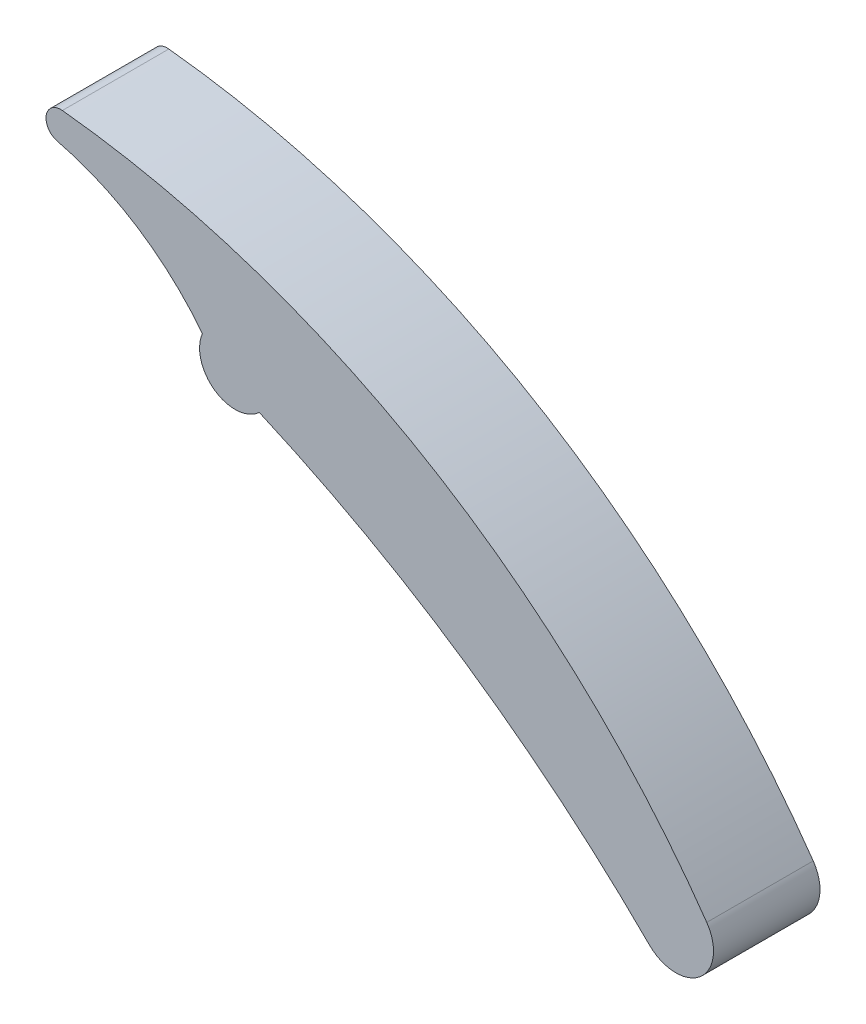
ISO-10303-21;
HEADER;
FILE_DESCRIPTION(('STEP AP214'),'2;1');
FILE_NAME('part.step','',(''),(''),'','','');
FILE_SCHEMA(('AUTOMOTIVE_DESIGN { 1 0 10303 214 1 1 1 1 }'));
ENDSEC;
DATA;
#1=APPLICATION_CONTEXT('core data for automotive mechanical design processes');
#2=APPLICATION_PROTOCOL_DEFINITION('international standard','automotive_design',2000,#1);
#3=PRODUCT_CONTEXT('',#1,'mechanical');
#4=PRODUCT('Part','Part','',(#3));
#5=PRODUCT_RELATED_PRODUCT_CATEGORY('part','',(#4));
#6=PRODUCT_DEFINITION_FORMATION('','',#4);
#7=PRODUCT_DEFINITION_CONTEXT('part definition',#1,'design');
#8=PRODUCT_DEFINITION('design','',#6,#7);
#9=PRODUCT_DEFINITION_SHAPE('','',#8);
#10=(LENGTH_UNIT() NAMED_UNIT(*) SI_UNIT(.MILLI.,.METRE.));
#11=(NAMED_UNIT(*) PLANE_ANGLE_UNIT() SI_UNIT($,.RADIAN.));
#12=(NAMED_UNIT(*) SI_UNIT($,.STERADIAN.) SOLID_ANGLE_UNIT());
#13=UNCERTAINTY_MEASURE_WITH_UNIT(LENGTH_MEASURE(1.E-05),#10,'distance_accuracy_value','');
#14=(GEOMETRIC_REPRESENTATION_CONTEXT(3) GLOBAL_UNCERTAINTY_ASSIGNED_CONTEXT((#13)) GLOBAL_UNIT_ASSIGNED_CONTEXT((#10,
#11,#12)) REPRESENTATION_CONTEXT('',''));
#15=CARTESIAN_POINT('',(0.,0.,0.));
#16=DIRECTION('',(0.,0.,1.));
#17=DIRECTION('',(1.,0.,0.));
#18=AXIS2_PLACEMENT_3D('',#15,#16,#17);
#19=CARTESIAN_POINT('',(-49.1044540456095,34.4782916178082,15.));
#20=DIRECTION('',(0.,0.,-1.));
#21=DIRECTION('',(-1.,0.,0.));
#22=AXIS2_PLACEMENT_3D('',#19,#20,#21);
#23=CYLINDRICAL_SURFACE('',#22,4.17090482656178);
#24=CARTESIAN_POINT('',(-49.1044540456095,34.4782916178082,-15.));
#25=DIRECTION('',(0.,0.,-1.));
#26=DIRECTION('',(-1.,0.,0.));
#27=AXIS2_PLACEMENT_3D('',#24,#25,#26);
#28=CIRCLE('',#27,4.17090482656178);
#29=CARTESIAN_POINT('',(-50.1017609381639,30.428374824305,-15.));
#30=VERTEX_POINT('',#29);
#31=CARTESIAN_POINT('',(-48.6620533884795,38.6256677438435,-15.));
#32=VERTEX_POINT('',#31);
#33=EDGE_CURVE('E119',#30,#32,#28,.T.);
#34=ORIENTED_EDGE('',*,*,#33,.F.);
#35=DIRECTION('',(0.,0.,-1.));
#36=VECTOR('',#35,1.);
#37=CARTESIAN_POINT('',(-50.1017609381639,30.428374824305,15.));
#38=LINE('',#37,#36);
#39=CARTESIAN_POINT('',(-50.1017609381639,30.428374824305,15.));
#40=VERTEX_POINT('',#39);
#41=EDGE_CURVE('E11',#40,#30,#38,.T.);
#42=ORIENTED_EDGE('',*,*,#41,.F.);
#43=CARTESIAN_POINT('',(-49.1044540456095,34.4782916178082,15.));
#44=DIRECTION('',(0.,0.,-1.));
#45=DIRECTION('',(-1.,0.,0.));
#46=AXIS2_PLACEMENT_3D('',#43,#44,#45);
#47=CIRCLE('',#46,4.17090482656178);
#48=CARTESIAN_POINT('',(-48.6620533884795,38.6256677438435,15.));
#49=VERTEX_POINT('',#48);
#50=EDGE_CURVE('E132',#40,#49,#47,.T.);
#51=ORIENTED_EDGE('',*,*,#50,.T.);
#52=DIRECTION('',(0.,0.,-1.));
#53=VECTOR('',#52,1.);
#54=CARTESIAN_POINT('',(-48.6620533884795,38.6256677438435,15.));
#55=LINE('',#54,#53);
#56=EDGE_CURVE('E38',#49,#32,#55,.T.);
#57=ORIENTED_EDGE('',*,*,#56,.T.);
#58=EDGE_LOOP('',(#34,#42,#51,#57));
#59=FACE_BOUND('',#58,.T.);
#60=ADVANCED_FACE('F35',(#59),#23,.T.);
#61=CARTESIAN_POINT('',(-67.8912246654771,-41.8120242289201,15.));
#62=DIRECTION('',(0.,0.,-1.));
#63=DIRECTION('',(-1.,0.,0.));
#64=AXIS2_PLACEMENT_3D('',#61,#62,#63);
#65=CYLINDRICAL_SURFACE('',#64,74.3985233393418);
#66=CARTESIAN_POINT('',(-67.8912246654771,-41.8120242289201,-15.));
#67=DIRECTION('',(0.,0.,-1.));
#68=DIRECTION('',(-1.,0.,0.));
#69=AXIS2_PLACEMENT_3D('',#66,#67,#68);
#70=CIRCLE('',#69,74.3985233393418);
#71=CARTESIAN_POINT('',(-9.20259716589065,3.9130813181355,-15.));
#72=VERTEX_POINT('',#71);
#73=EDGE_CURVE('E131',#30,#72,#70,.T.);
#74=ORIENTED_EDGE('',*,*,#73,.T.);
#75=DIRECTION('',(0.,0.,-1.));
#76=VECTOR('',#75,1.);
#77=CARTESIAN_POINT('',(-9.20259716589065,3.9130813181355,15.));
#78=LINE('',#77,#76);
#79=CARTESIAN_POINT('',(-9.20259716589065,3.9130813181355,15.));
#80=VERTEX_POINT('',#79);
#81=EDGE_CURVE('E44',#80,#72,#78,.T.);
#82=ORIENTED_EDGE('',*,*,#81,.F.);
#83=CARTESIAN_POINT('',(-67.8912246654771,-41.8120242289201,15.));
#84=DIRECTION('',(0.,0.,-1.));
#85=DIRECTION('',(-1.,0.,0.));
#86=AXIS2_PLACEMENT_3D('',#83,#84,#85);
#87=CIRCLE('',#86,74.3985233393418);
#88=EDGE_CURVE('E114',#40,#80,#87,.T.);
#89=ORIENTED_EDGE('',*,*,#88,.F.);
#90=ORIENTED_EDGE('',*,*,#41,.T.);
#91=EDGE_LOOP('',(#74,#82,#89,#90));
#92=FACE_BOUND('',#91,.T.);
#93=ADVANCED_FACE('F140',(#92),#65,.F.);
#94=CARTESIAN_POINT('',(0.,0.,15.));
#95=DIRECTION('',(0.,0.,-1.));
#96=DIRECTION('',(-1.,0.,0.));
#97=AXIS2_PLACEMENT_3D('',#94,#95,#96);
#98=CYLINDRICAL_SURFACE('',#97,10.);
#99=CARTESIAN_POINT('',(0.,0.,-15.));
#100=DIRECTION('',(0.,0.,-1.));
#101=DIRECTION('',(-1.,0.,0.));
#102=AXIS2_PLACEMENT_3D('',#99,#100,#101);
#103=CIRCLE('',#102,10.);
#104=CARTESIAN_POINT('',(6.81477835298899,-7.31838752729265,-15.));
#105=VERTEX_POINT('',#104);
#106=EDGE_CURVE('E98',#105,#72,#103,.T.);
#107=ORIENTED_EDGE('',*,*,#106,.F.);
#108=DIRECTION('',(0.,0.,-1.));
#109=VECTOR('',#108,1.);
#110=CARTESIAN_POINT('',(6.81477835298899,-7.31838752729265,15.));
#111=LINE('',#110,#109);
#112=CARTESIAN_POINT('',(6.81477835298899,-7.31838752729265,15.));
#113=VERTEX_POINT('',#112);
#114=EDGE_CURVE('E92',#113,#105,#111,.T.);
#115=ORIENTED_EDGE('',*,*,#114,.F.);
#116=CARTESIAN_POINT('',(0.,0.,15.));
#117=DIRECTION('',(0.,0.,-1.));
#118=DIRECTION('',(-1.,0.,0.));
#119=AXIS2_PLACEMENT_3D('',#116,#117,#118);
#120=CIRCLE('',#119,10.);
#121=EDGE_CURVE('E96',#113,#80,#120,.T.);
#122=ORIENTED_EDGE('',*,*,#121,.T.);
#123=ORIENTED_EDGE('',*,*,#81,.T.);
#124=EDGE_LOOP('',(#107,#115,#122,#123));
#125=FACE_BOUND('',#124,.T.);
#126=ADVANCED_FACE('F94',(#125),#98,.T.);
#127=CARTESIAN_POINT('',(-136.612685388054,-335.664387312936,15.));
#128=DIRECTION('',(0.,0.,-1.));
#129=DIRECTION('',(-1.,0.,0.));
#130=AXIS2_PLACEMENT_3D('',#127,#128,#129);
#131=CYLINDRICAL_SURFACE('',#130,358.305083595561);
#132=CARTESIAN_POINT('',(-136.612685388054,-335.664387312936,-15.));
#133=DIRECTION('',(0.,0.,-1.));
#134=DIRECTION('',(-1.,0.,0.));
#135=AXIS2_PLACEMENT_3D('',#132,#133,#134);
#136=CIRCLE('',#135,358.305083595561);
#137=CARTESIAN_POINT('',(116.72801051163,-82.2851759883177,-15.));
#138=VERTEX_POINT('',#137);
#139=EDGE_CURVE('E128',#105,#138,#136,.T.);
#140=ORIENTED_EDGE('',*,*,#139,.T.);
#141=DIRECTION('',(0.,0.,-1.));
#142=VECTOR('',#141,1.);
#143=CARTESIAN_POINT('',(116.72801051163,-82.2851759883177,15.));
#144=LINE('',#143,#142);
#145=CARTESIAN_POINT('',(116.72801051163,-82.2851759883177,15.));
#146=VERTEX_POINT('',#145);
#147=EDGE_CURVE('E102',#146,#138,#144,.T.);
#148=ORIENTED_EDGE('',*,*,#147,.F.);
#149=CARTESIAN_POINT('',(-136.612685388054,-335.664387312936,15.));
#150=DIRECTION('',(0.,0.,-1.));
#151=DIRECTION('',(-1.,0.,0.));
#152=AXIS2_PLACEMENT_3D('',#149,#150,#151);
#153=CIRCLE('',#152,358.305083595561);
#154=EDGE_CURVE('E105',#113,#146,#153,.T.);
#155=ORIENTED_EDGE('',*,*,#154,.F.);
#156=ORIENTED_EDGE('',*,*,#114,.T.);
#157=EDGE_LOOP('',(#140,#148,#155,#156));
#158=FACE_BOUND('',#157,.T.);
#159=ADVANCED_FACE('F106',(#158),#131,.F.);
#160=CARTESIAN_POINT('',(124.225475611777,-74.7865710473995,15.));
#161=DIRECTION('',(0.,0.,-1.));
#162=DIRECTION('',(-1.,0.,0.));
#163=AXIS2_PLACEMENT_3D('',#160,#161,#162);
#164=CYLINDRICAL_SURFACE('',#163,10.6038228478168);
#165=CARTESIAN_POINT('',(124.225475611777,-74.7865710473995,-15.));
#166=DIRECTION('',(0.,0.,-1.));
#167=DIRECTION('',(-1.,0.,0.));
#168=AXIS2_PLACEMENT_3D('',#165,#166,#167);
#169=CIRCLE('',#168,10.6038228478168);
#170=CARTESIAN_POINT('',(132.921228365391,-68.7182151715548,-15.));
#171=VERTEX_POINT('',#170);
#172=EDGE_CURVE('E125',#171,#138,#169,.T.);
#173=ORIENTED_EDGE('',*,*,#172,.F.);
#174=DIRECTION('',(0.,0.,-1.));
#175=VECTOR('',#174,1.);
#176=CARTESIAN_POINT('',(132.921228365391,-68.7182151715548,15.));
#177=LINE('',#176,#175);
#178=CARTESIAN_POINT('',(132.921228365391,-68.7182151715548,15.));
#179=VERTEX_POINT('',#178);
#180=EDGE_CURVE('E135',#179,#171,#177,.T.);
#181=ORIENTED_EDGE('',*,*,#180,.F.);
#182=CARTESIAN_POINT('',(124.225475611777,-74.7865710473995,15.));
#183=DIRECTION('',(0.,0.,-1.));
#184=DIRECTION('',(-1.,0.,0.));
#185=AXIS2_PLACEMENT_3D('',#182,#183,#184);
#186=CIRCLE('',#185,10.6038228478168);
#187=EDGE_CURVE('E110',#179,#146,#186,.T.);
#188=ORIENTED_EDGE('',*,*,#187,.T.);
#189=ORIENTED_EDGE('',*,*,#147,.T.);
#190=EDGE_LOOP('',(#173,#181,#188,#189));
#191=FACE_BOUND('',#190,.T.);
#192=ADVANCED_FACE('F145',(#191),#164,.T.);
#193=CARTESIAN_POINT('',(-75.6375349899816,-214.261543383192,15.));
#194=DIRECTION('',(0.,0.,-1.));
#195=DIRECTION('',(-1.,0.,0.));
#196=AXIS2_PLACEMENT_3D('',#193,#194,#195);
#197=CYLINDRICAL_SURFACE('',#196,254.321879041585);
#198=CARTESIAN_POINT('',(-75.6375349899816,-214.261543383192,-15.));
#199=DIRECTION('',(0.,0.,-1.));
#200=DIRECTION('',(-1.,0.,0.));
#201=AXIS2_PLACEMENT_3D('',#198,#199,#200);
#202=CIRCLE('',#201,254.321879041585);
#203=EDGE_CURVE('E122',#32,#171,#202,.T.);
#204=ORIENTED_EDGE('',*,*,#203,.F.);
#205=ORIENTED_EDGE('',*,*,#56,.F.);
#206=CARTESIAN_POINT('',(-75.6375349899816,-214.261543383192,15.));
#207=DIRECTION('',(0.,0.,-1.));
#208=DIRECTION('',(-1.,0.,0.));
#209=AXIS2_PLACEMENT_3D('',#206,#207,#208);
#210=CIRCLE('',#209,254.321879041585);
#211=EDGE_CURVE('E141',#49,#179,#210,.T.);
#212=ORIENTED_EDGE('',*,*,#211,.T.);
#213=ORIENTED_EDGE('',*,*,#180,.T.);
#214=EDGE_LOOP('',(#204,#205,#212,#213));
#215=FACE_BOUND('',#214,.T.);
#216=ADVANCED_FACE('F137',(#215),#197,.T.);
#217=CARTESIAN_POINT('',(-62.3709945177956,-89.8916258826917,15.));
#218=DIRECTION('',(0.,0.,-1.));
#219=DIRECTION('',(-1.,0.,0.));
#220=AXIS2_PLACEMENT_3D('',#217,#218,#219);
#221=PLANE('',#220);
#222=ORIENTED_EDGE('',*,*,#50,.F.);
#223=ORIENTED_EDGE('',*,*,#88,.T.);
#224=ORIENTED_EDGE('',*,*,#121,.F.);
#225=ORIENTED_EDGE('',*,*,#154,.T.);
#226=ORIENTED_EDGE('',*,*,#187,.F.);
#227=ORIENTED_EDGE('',*,*,#211,.F.);
#228=EDGE_LOOP('',(#222,#223,#224,#225,#226,#227));
#229=FACE_BOUND('',#228,.T.);
#230=ADVANCED_FACE('F113',(#229),#221,.F.);
#231=CARTESIAN_POINT('',(-62.3709945177956,-89.8916258826917,-15.));
#232=DIRECTION('',(0.,0.,-1.));
#233=DIRECTION('',(-1.,0.,0.));
#234=AXIS2_PLACEMENT_3D('',#231,#232,#233);
#235=PLANE('',#234);
#236=ORIENTED_EDGE('',*,*,#33,.T.);
#237=ORIENTED_EDGE('',*,*,#203,.T.);
#238=ORIENTED_EDGE('',*,*,#172,.T.);
#239=ORIENTED_EDGE('',*,*,#139,.F.);
#240=ORIENTED_EDGE('',*,*,#106,.T.);
#241=ORIENTED_EDGE('',*,*,#73,.F.);
#242=EDGE_LOOP('',(#236,#237,#238,#239,#240,#241));
#243=FACE_BOUND('',#242,.T.);
#244=ADVANCED_FACE('F139',(#243),#235,.T.);
#245=CLOSED_SHELL('',(#60,#93,#126,#159,#192,#216,#230,#244));
#246=MANIFOLD_SOLID_BREP('B2',#245);
#247=ADVANCED_BREP_SHAPE_REPRESENTATION('',(#18,#246),#14);
#248=SHAPE_DEFINITION_REPRESENTATION(#9,#247);
ENDSEC;
END-ISO-10303-21;
